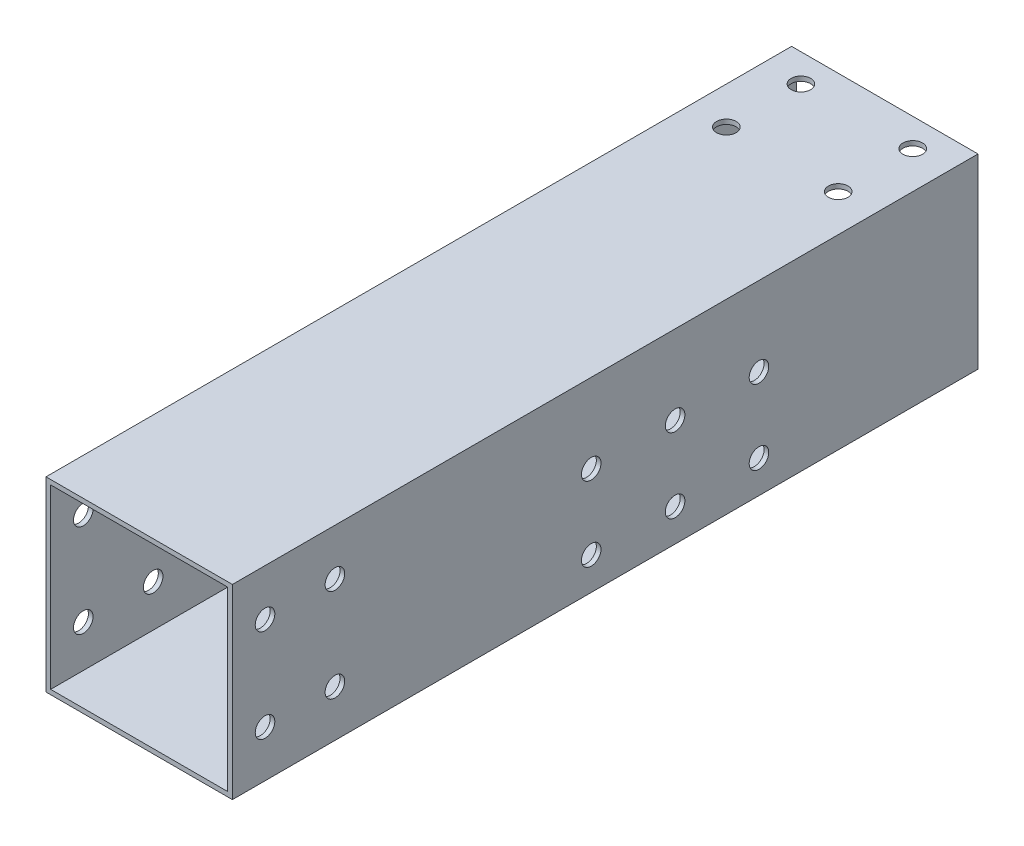
ISO-10303-21;
HEADER;
FILE_DESCRIPTION(('STEP AP214'),'2;1');
FILE_NAME('part.step','',(''),(''),'','','');
FILE_SCHEMA(('AUTOMOTIVE_DESIGN { 1 0 10303 214 1 1 1 1 }'));
ENDSEC;
DATA;
#1=APPLICATION_CONTEXT('core data for automotive mechanical design processes');
#2=APPLICATION_PROTOCOL_DEFINITION('international standard','automotive_design',2000,#1);
#3=PRODUCT_CONTEXT('',#1,'mechanical');
#4=PRODUCT('Part','Part','',(#3));
#5=PRODUCT_RELATED_PRODUCT_CATEGORY('part','',(#4));
#6=PRODUCT_DEFINITION_FORMATION('','',#4);
#7=PRODUCT_DEFINITION_CONTEXT('part definition',#1,'design');
#8=PRODUCT_DEFINITION('design','',#6,#7);
#9=PRODUCT_DEFINITION_SHAPE('','',#8);
#10=(LENGTH_UNIT() NAMED_UNIT(*) SI_UNIT(.MILLI.,.METRE.));
#11=(NAMED_UNIT(*) PLANE_ANGLE_UNIT() SI_UNIT($,.RADIAN.));
#12=(NAMED_UNIT(*) SI_UNIT($,.STERADIAN.) SOLID_ANGLE_UNIT());
#13=UNCERTAINTY_MEASURE_WITH_UNIT(LENGTH_MEASURE(1.E-05),#10,'distance_accuracy_value','');
#14=(GEOMETRIC_REPRESENTATION_CONTEXT(3) GLOBAL_UNCERTAINTY_ASSIGNED_CONTEXT((#13)) GLOBAL_UNIT_ASSIGNED_CONTEXT((#10,
#11,#12)) REPRESENTATION_CONTEXT('',''));
#15=CARTESIAN_POINT('',(0.,0.,0.));
#16=DIRECTION('',(0.,0.,1.));
#17=DIRECTION('',(1.,0.,0.));
#18=AXIS2_PLACEMENT_3D('',#15,#16,#17);
#19=CARTESIAN_POINT('',(0.,0.,160.));
#20=DIRECTION('',(0.,0.,-1.));
#21=DIRECTION('',(-1.,0.,0.));
#22=AXIS2_PLACEMENT_3D('',#19,#20,#21);
#23=PLANE('',#22);
#24=DIRECTION('',(0.,-1.,0.));
#25=VECTOR('',#24,1.);
#26=CARTESIAN_POINT('',(0.,0.,160.));
#27=LINE('',#26,#25);
#28=CARTESIAN_POINT('',(0.,40.,160.));
#29=VERTEX_POINT('',#28);
#30=CARTESIAN_POINT('',(0.,0.,160.));
#31=VERTEX_POINT('',#30);
#32=EDGE_CURVE('E140',#29,#31,#27,.T.);
#33=ORIENTED_EDGE('',*,*,#32,.T.);
#34=DIRECTION('',(1.,0.,0.));
#35=VECTOR('',#34,1.);
#36=CARTESIAN_POINT('',(0.,0.,160.));
#37=LINE('',#36,#35);
#38=CARTESIAN_POINT('',(40.,0.,160.));
#39=VERTEX_POINT('',#38);
#40=EDGE_CURVE('E143',#31,#39,#37,.T.);
#41=ORIENTED_EDGE('',*,*,#40,.T.);
#42=DIRECTION('',(0.,1.,0.));
#43=VECTOR('',#42,1.);
#44=CARTESIAN_POINT('',(40.,0.,160.));
#45=LINE('',#44,#43);
#46=CARTESIAN_POINT('',(40.,40.,160.));
#47=VERTEX_POINT('',#46);
#48=EDGE_CURVE('E146',#39,#47,#45,.T.);
#49=ORIENTED_EDGE('',*,*,#48,.T.);
#50=DIRECTION('',(-1.,0.,0.));
#51=VECTOR('',#50,1.);
#52=CARTESIAN_POINT('',(0.,40.,160.));
#53=LINE('',#52,#51);
#54=EDGE_CURVE('E148',#47,#29,#53,.T.);
#55=ORIENTED_EDGE('',*,*,#54,.T.);
#56=EDGE_LOOP('',(#33,#41,#49,#55));
#57=FACE_BOUND('',#56,.T.);
#58=DIRECTION('',(0.,-1.,0.));
#59=VECTOR('',#58,1.);
#60=CARTESIAN_POINT('',(1.,0.999999999999999,160.));
#61=LINE('',#60,#59);
#62=CARTESIAN_POINT('',(1.,39.,160.));
#63=VERTEX_POINT('',#62);
#64=CARTESIAN_POINT('',(1.,0.999999999999999,160.));
#65=VERTEX_POINT('',#64);
#66=EDGE_CURVE('E102',#63,#65,#61,.T.);
#67=ORIENTED_EDGE('',*,*,#66,.F.);
#68=DIRECTION('',(-1.,0.,0.));
#69=VECTOR('',#68,1.);
#70=CARTESIAN_POINT('',(1.,39.,160.));
#71=LINE('',#70,#69);
#72=CARTESIAN_POINT('',(39.,39.,160.));
#73=VERTEX_POINT('',#72);
#74=EDGE_CURVE('E124',#73,#63,#71,.T.);
#75=ORIENTED_EDGE('',*,*,#74,.F.);
#76=DIRECTION('',(0.,1.,0.));
#77=VECTOR('',#76,1.);
#78=CARTESIAN_POINT('',(39.,0.999999999999999,160.));
#79=LINE('',#78,#77);
#80=CARTESIAN_POINT('',(39.,0.999999999999999,160.));
#81=VERTEX_POINT('',#80);
#82=EDGE_CURVE('E122',#81,#73,#79,.T.);
#83=ORIENTED_EDGE('',*,*,#82,.F.);
#84=DIRECTION('',(1.,0.,0.));
#85=VECTOR('',#84,1.);
#86=CARTESIAN_POINT('',(1.,0.999999999999999,160.));
#87=LINE('',#86,#85);
#88=EDGE_CURVE('E110',#65,#81,#87,.T.);
#89=ORIENTED_EDGE('',*,*,#88,.F.);
#90=EDGE_LOOP('',(#67,#75,#83,#89));
#91=FACE_BOUND('',#90,.T.);
#92=ADVANCED_FACE('F35',(#57,#91),#23,.F.);
#93=CARTESIAN_POINT('',(0.,0.,0.));
#94=DIRECTION('',(0.,0.,-1.));
#95=DIRECTION('',(-1.,0.,0.));
#96=AXIS2_PLACEMENT_3D('',#93,#94,#95);
#97=PLANE('',#96);
#98=DIRECTION('',(0.,-1.,0.));
#99=VECTOR('',#98,1.);
#100=CARTESIAN_POINT('',(0.,0.,0.));
#101=LINE('',#100,#99);
#102=CARTESIAN_POINT('',(0.,40.,0.));
#103=VERTEX_POINT('',#102);
#104=CARTESIAN_POINT('',(0.,0.,0.));
#105=VERTEX_POINT('',#104);
#106=EDGE_CURVE('E118',#103,#105,#101,.T.);
#107=ORIENTED_EDGE('',*,*,#106,.F.);
#108=DIRECTION('',(-1.,0.,0.));
#109=VECTOR('',#108,1.);
#110=CARTESIAN_POINT('',(0.,40.,0.));
#111=LINE('',#110,#109);
#112=CARTESIAN_POINT('',(40.,40.,0.));
#113=VERTEX_POINT('',#112);
#114=EDGE_CURVE('E144',#113,#103,#111,.T.);
#115=ORIENTED_EDGE('',*,*,#114,.F.);
#116=DIRECTION('',(0.,1.,0.));
#117=VECTOR('',#116,1.);
#118=CARTESIAN_POINT('',(40.,0.,0.));
#119=LINE('',#118,#117);
#120=CARTESIAN_POINT('',(40.,0.,0.));
#121=VERTEX_POINT('',#120);
#122=EDGE_CURVE('E155',#121,#113,#119,.T.);
#123=ORIENTED_EDGE('',*,*,#122,.F.);
#124=DIRECTION('',(1.,0.,0.));
#125=VECTOR('',#124,1.);
#126=CARTESIAN_POINT('',(0.,0.,0.));
#127=LINE('',#126,#125);
#128=EDGE_CURVE('E153',#105,#121,#127,.T.);
#129=ORIENTED_EDGE('',*,*,#128,.F.);
#130=EDGE_LOOP('',(#107,#115,#123,#129));
#131=FACE_BOUND('',#130,.T.);
#132=DIRECTION('',(-1.,0.,0.));
#133=VECTOR('',#132,1.);
#134=CARTESIAN_POINT('',(1.,39.,0.));
#135=LINE('',#134,#133);
#136=CARTESIAN_POINT('',(39.,39.,0.));
#137=VERTEX_POINT('',#136);
#138=CARTESIAN_POINT('',(1.,39.,0.));
#139=VERTEX_POINT('',#138);
#140=EDGE_CURVE('E111',#137,#139,#135,.T.);
#141=ORIENTED_EDGE('',*,*,#140,.T.);
#142=DIRECTION('',(0.,-1.,0.));
#143=VECTOR('',#142,1.);
#144=CARTESIAN_POINT('',(1.,0.999999999999999,0.));
#145=LINE('',#144,#143);
#146=CARTESIAN_POINT('',(1.,0.999999999999999,0.));
#147=VERTEX_POINT('',#146);
#148=EDGE_CURVE('E60',#139,#147,#145,.T.);
#149=ORIENTED_EDGE('',*,*,#148,.T.);
#150=DIRECTION('',(1.,0.,0.));
#151=VECTOR('',#150,1.);
#152=CARTESIAN_POINT('',(1.,0.999999999999999,0.));
#153=LINE('',#152,#151);
#154=CARTESIAN_POINT('',(39.,0.999999999999999,0.));
#155=VERTEX_POINT('',#154);
#156=EDGE_CURVE('E117',#147,#155,#153,.T.);
#157=ORIENTED_EDGE('',*,*,#156,.T.);
#158=DIRECTION('',(0.,1.,0.));
#159=VECTOR('',#158,1.);
#160=CARTESIAN_POINT('',(39.,0.999999999999999,0.));
#161=LINE('',#160,#159);
#162=EDGE_CURVE('E132',#155,#137,#161,.T.);
#163=ORIENTED_EDGE('',*,*,#162,.T.);
#164=EDGE_LOOP('',(#141,#149,#157,#163));
#165=FACE_BOUND('',#164,.T.);
#166=ADVANCED_FACE('F297',(#131,#165),#97,.T.);
#167=CARTESIAN_POINT('',(0.,0.,160.));
#168=DIRECTION('',(1.,0.,0.));
#169=DIRECTION('',(0.,0.,-1.));
#170=AXIS2_PLACEMENT_3D('',#167,#168,#169);
#171=PLANE('',#170);
#172=CARTESIAN_POINT('',(0.,29.9999999999999,153.));
#173=DIRECTION('',(-1.,0.,0.));
#174=DIRECTION('',(0.,0.,1.));
#175=AXIS2_PLACEMENT_3D('',#172,#173,#174);
#176=CIRCLE('',#175,2.10000000000938);
#177=CARTESIAN_POINT('',(0.,29.9999999999999,155.10000000001));
#178=VERTEX_POINT('',#177);
#179=EDGE_CURVE('E412',#178,#178,#176,.T.);
#180=ORIENTED_EDGE('',*,*,#179,.F.);
#181=EDGE_LOOP('',(#180));
#182=FACE_BOUND('',#181,.T.);
#183=CARTESIAN_POINT('',(0.,9.99999999999989,153.));
#184=DIRECTION('',(-1.,0.,0.));
#185=DIRECTION('',(0.,0.,1.));
#186=AXIS2_PLACEMENT_3D('',#183,#184,#185);
#187=CIRCLE('',#186,2.10000000000938);
#188=CARTESIAN_POINT('',(0.,9.99999999999989,155.10000000001));
#189=VERTEX_POINT('',#188);
#190=EDGE_CURVE('E416',#189,#189,#187,.T.);
#191=ORIENTED_EDGE('',*,*,#190,.F.);
#192=EDGE_LOOP('',(#191));
#193=FACE_BOUND('',#192,.T.);
#194=CARTESIAN_POINT('',(0.,29.9999999999999,138.));
#195=DIRECTION('',(-1.,0.,0.));
#196=DIRECTION('',(0.,0.,1.));
#197=AXIS2_PLACEMENT_3D('',#194,#195,#196);
#198=CIRCLE('',#197,2.10000000000938);
#199=CARTESIAN_POINT('',(0.,29.9999999999999,140.100000000009));
#200=VERTEX_POINT('',#199);
#201=EDGE_CURVE('E420',#200,#200,#198,.T.);
#202=ORIENTED_EDGE('',*,*,#201,.F.);
#203=EDGE_LOOP('',(#202));
#204=FACE_BOUND('',#203,.T.);
#205=CARTESIAN_POINT('',(0.,23.0000000000002,82.9999999999977));
#206=DIRECTION('',(-1.,0.,0.));
#207=DIRECTION('',(0.,0.,1.));
#208=AXIS2_PLACEMENT_3D('',#205,#206,#207);
#209=CIRCLE('',#208,2.10000000003336);
#210=CARTESIAN_POINT('',(0.,23.0000000000002,85.1000000000311));
#211=VERTEX_POINT('',#210);
#212=EDGE_CURVE('E424',#211,#211,#209,.T.);
#213=ORIENTED_EDGE('',*,*,#212,.F.);
#214=EDGE_LOOP('',(#213));
#215=FACE_BOUND('',#214,.T.);
#216=CARTESIAN_POINT('',(0.,7.00000000000009,64.9999999999978));
#217=DIRECTION('',(-1.,0.,0.));
#218=DIRECTION('',(0.,0.,1.));
#219=AXIS2_PLACEMENT_3D('',#216,#217,#218);
#220=CIRCLE('',#219,2.10000000003336);
#221=CARTESIAN_POINT('',(0.,7.00000000000009,67.1000000000311));
#222=VERTEX_POINT('',#221);
#223=EDGE_CURVE('E428',#222,#222,#220,.T.);
#224=ORIENTED_EDGE('',*,*,#223,.F.);
#225=EDGE_LOOP('',(#224));
#226=FACE_BOUND('',#225,.T.);
#227=CARTESIAN_POINT('',(0.,23.0000000000001,64.9999999999977));
#228=DIRECTION('',(-1.,0.,0.));
#229=DIRECTION('',(0.,0.,1.));
#230=AXIS2_PLACEMENT_3D('',#227,#228,#229);
#231=CIRCLE('',#230,2.10000000003336);
#232=CARTESIAN_POINT('',(0.,23.0000000000001,67.1000000000311));
#233=VERTEX_POINT('',#232);
#234=EDGE_CURVE('E432',#233,#233,#231,.T.);
#235=ORIENTED_EDGE('',*,*,#234,.F.);
#236=EDGE_LOOP('',(#235));
#237=FACE_BOUND('',#236,.T.);
#238=CARTESIAN_POINT('',(0.,7.00000000000002,46.9999999999978));
#239=DIRECTION('',(-1.,0.,0.));
#240=DIRECTION('',(0.,0.,1.));
#241=AXIS2_PLACEMENT_3D('',#238,#239,#240);
#242=CIRCLE('',#241,2.10000000003336);
#243=CARTESIAN_POINT('',(0.,7.00000000000002,49.1000000000311));
#244=VERTEX_POINT('',#243);
#245=EDGE_CURVE('E436',#244,#244,#242,.T.);
#246=ORIENTED_EDGE('',*,*,#245,.F.);
#247=EDGE_LOOP('',(#246));
#248=FACE_BOUND('',#247,.T.);
#249=CARTESIAN_POINT('',(0.,23.,46.9999999999977));
#250=DIRECTION('',(-1.,0.,0.));
#251=DIRECTION('',(0.,0.,1.));
#252=AXIS2_PLACEMENT_3D('',#249,#250,#251);
#253=CIRCLE('',#252,2.10000000003336);
#254=CARTESIAN_POINT('',(0.,23.,49.1000000000311));
#255=VERTEX_POINT('',#254);
#256=EDGE_CURVE('E365',#255,#255,#253,.T.);
#257=ORIENTED_EDGE('',*,*,#256,.F.);
#258=EDGE_LOOP('',(#257));
#259=FACE_BOUND('',#258,.T.);
#260=CARTESIAN_POINT('',(0.,7.00000000000015,82.9999999999978));
#261=DIRECTION('',(-1.,0.,0.));
#262=DIRECTION('',(0.,0.,1.));
#263=AXIS2_PLACEMENT_3D('',#260,#261,#262);
#264=CIRCLE('',#263,2.10000000003336);
#265=CARTESIAN_POINT('',(0.,7.00000000000015,85.1000000000311));
#266=VERTEX_POINT('',#265);
#267=EDGE_CURVE('E442',#266,#266,#264,.T.);
#268=ORIENTED_EDGE('',*,*,#267,.F.);
#269=EDGE_LOOP('',(#268));
#270=FACE_BOUND('',#269,.T.);
#271=CARTESIAN_POINT('',(0.,9.99999999999988,138.));
#272=DIRECTION('',(-1.,0.,0.));
#273=DIRECTION('',(0.,0.,1.));
#274=AXIS2_PLACEMENT_3D('',#271,#272,#273);
#275=CIRCLE('',#274,2.10000000000938);
#276=CARTESIAN_POINT('',(0.,9.99999999999988,140.100000000009));
#277=VERTEX_POINT('',#276);
#278=EDGE_CURVE('E360',#277,#277,#275,.T.);
#279=ORIENTED_EDGE('',*,*,#278,.F.);
#280=EDGE_LOOP('',(#279));
#281=FACE_BOUND('',#280,.T.);
#282=ORIENTED_EDGE('',*,*,#106,.T.);
#283=DIRECTION('',(0.,0.,-1.));
#284=VECTOR('',#283,1.);
#285=CARTESIAN_POINT('',(0.,0.,160.));
#286=LINE('',#285,#284);
#287=EDGE_CURVE('E11',#31,#105,#286,.T.);
#288=ORIENTED_EDGE('',*,*,#287,.F.);
#289=ORIENTED_EDGE('',*,*,#32,.F.);
#290=DIRECTION('',(0.,0.,-1.));
#291=VECTOR('',#290,1.);
#292=CARTESIAN_POINT('',(0.,40.,160.));
#293=LINE('',#292,#291);
#294=EDGE_CURVE('E150',#29,#103,#293,.T.);
#295=ORIENTED_EDGE('',*,*,#294,.T.);
#296=EDGE_LOOP('',(#282,#288,#289,#295));
#297=FACE_BOUND('',#296,.T.);
#298=ADVANCED_FACE('F37',(#182,#193,#204,#215,#226,#237,#248,#259,#270,#281,#297),#171,.F.);
#299=CARTESIAN_POINT('',(0.,0.,160.));
#300=DIRECTION('',(0.,1.,0.));
#301=DIRECTION('',(0.,0.,1.));
#302=AXIS2_PLACEMENT_3D('',#299,#300,#301);
#303=PLANE('',#302);
#304=CARTESIAN_POINT('',(32.0000000002429,0.,5.99999999998566));
#305=DIRECTION('',(0.,-1.,0.));
#306=DIRECTION('',(0.,0.,-1.));
#307=AXIS2_PLACEMENT_3D('',#304,#305,#306);
#308=CIRCLE('',#307,2.09999999982409);
#309=CARTESIAN_POINT('',(32.0000000002429,0.,3.90000000016157));
#310=VERTEX_POINT('',#309);
#311=EDGE_CURVE('E230',#310,#310,#308,.T.);
#312=ORIENTED_EDGE('',*,*,#311,.F.);
#313=EDGE_LOOP('',(#312));
#314=FACE_BOUND('',#313,.T.);
#315=CARTESIAN_POINT('',(8.00000000024295,0.,21.9999999999857));
#316=DIRECTION('',(0.,-1.,0.));
#317=DIRECTION('',(0.,0.,-1.));
#318=AXIS2_PLACEMENT_3D('',#315,#316,#317);
#319=CIRCLE('',#318,2.09999999982409);
#320=CARTESIAN_POINT('',(8.00000000024295,0.,19.9000000001616));
#321=VERTEX_POINT('',#320);
#322=EDGE_CURVE('E241',#321,#321,#319,.T.);
#323=ORIENTED_EDGE('',*,*,#322,.F.);
#324=EDGE_LOOP('',(#323));
#325=FACE_BOUND('',#324,.T.);
#326=CARTESIAN_POINT('',(32.0000000002429,0.,21.9999999999857));
#327=DIRECTION('',(0.,-1.,0.));
#328=DIRECTION('',(0.,0.,-1.));
#329=AXIS2_PLACEMENT_3D('',#326,#327,#328);
#330=CIRCLE('',#329,2.09999999982409);
#331=CARTESIAN_POINT('',(32.0000000002429,0.,19.9000000001616));
#332=VERTEX_POINT('',#331);
#333=EDGE_CURVE('E235',#332,#332,#330,.T.);
#334=ORIENTED_EDGE('',*,*,#333,.F.);
#335=EDGE_LOOP('',(#334));
#336=FACE_BOUND('',#335,.T.);
#337=CARTESIAN_POINT('',(8.00000000024294,0.,5.99999999998566));
#338=DIRECTION('',(0.,-1.,0.));
#339=DIRECTION('',(0.,0.,-1.));
#340=AXIS2_PLACEMENT_3D('',#337,#338,#339);
#341=CIRCLE('',#340,2.09999999982409);
#342=CARTESIAN_POINT('',(8.00000000024294,0.,3.90000000016157));
#343=VERTEX_POINT('',#342);
#344=EDGE_CURVE('E234',#343,#343,#341,.T.);
#345=ORIENTED_EDGE('',*,*,#344,.F.);
#346=EDGE_LOOP('',(#345));
#347=FACE_BOUND('',#346,.T.);
#348=ORIENTED_EDGE('',*,*,#128,.T.);
#349=DIRECTION('',(0.,0.,-1.));
#350=VECTOR('',#349,1.);
#351=CARTESIAN_POINT('',(40.,0.,160.));
#352=LINE('',#351,#350);
#353=EDGE_CURVE('E44',#39,#121,#352,.T.);
#354=ORIENTED_EDGE('',*,*,#353,.F.);
#355=ORIENTED_EDGE('',*,*,#40,.F.);
#356=ORIENTED_EDGE('',*,*,#287,.T.);
#357=EDGE_LOOP('',(#348,#354,#355,#356));
#358=FACE_BOUND('',#357,.T.);
#359=ADVANCED_FACE('F283',(#314,#325,#336,#347,#358),#303,.F.);
#360=CARTESIAN_POINT('',(40.,0.,160.));
#361=DIRECTION('',(-1.,0.,0.));
#362=DIRECTION('',(0.,0.,1.));
#363=AXIS2_PLACEMENT_3D('',#360,#361,#362);
#364=PLANE('',#363);
#365=CARTESIAN_POINT('',(40.,29.9999999999999,153.));
#366=DIRECTION('',(-1.,0.,0.));
#367=DIRECTION('',(0.,0.,1.));
#368=AXIS2_PLACEMENT_3D('',#365,#366,#367);
#369=CIRCLE('',#368,2.10000000000938);
#370=CARTESIAN_POINT('',(40.,29.9999999999999,155.10000000001));
#371=VERTEX_POINT('',#370);
#372=EDGE_CURVE('E324',#371,#371,#369,.T.);
#373=ORIENTED_EDGE('',*,*,#372,.T.);
#374=EDGE_LOOP('',(#373));
#375=FACE_BOUND('',#374,.T.);
#376=CARTESIAN_POINT('',(40.,9.99999999999989,153.));
#377=DIRECTION('',(-1.,0.,0.));
#378=DIRECTION('',(0.,0.,1.));
#379=AXIS2_PLACEMENT_3D('',#376,#377,#378);
#380=CIRCLE('',#379,2.10000000000938);
#381=CARTESIAN_POINT('',(40.,9.99999999999989,155.10000000001));
#382=VERTEX_POINT('',#381);
#383=EDGE_CURVE('E328',#382,#382,#380,.T.);
#384=ORIENTED_EDGE('',*,*,#383,.T.);
#385=EDGE_LOOP('',(#384));
#386=FACE_BOUND('',#385,.T.);
#387=CARTESIAN_POINT('',(40.,29.9999999999999,138.));
#388=DIRECTION('',(-1.,0.,0.));
#389=DIRECTION('',(0.,0.,1.));
#390=AXIS2_PLACEMENT_3D('',#387,#388,#389);
#391=CIRCLE('',#390,2.10000000000938);
#392=CARTESIAN_POINT('',(40.,29.9999999999999,140.100000000009));
#393=VERTEX_POINT('',#392);
#394=EDGE_CURVE('E332',#393,#393,#391,.T.);
#395=ORIENTED_EDGE('',*,*,#394,.T.);
#396=EDGE_LOOP('',(#395));
#397=FACE_BOUND('',#396,.T.);
#398=CARTESIAN_POINT('',(40.,23.0000000000002,82.9999999999977));
#399=DIRECTION('',(-1.,0.,0.));
#400=DIRECTION('',(0.,0.,1.));
#401=AXIS2_PLACEMENT_3D('',#398,#399,#400);
#402=CIRCLE('',#401,2.10000000003336);
#403=CARTESIAN_POINT('',(40.,23.0000000000002,85.1000000000311));
#404=VERTEX_POINT('',#403);
#405=EDGE_CURVE('E336',#404,#404,#402,.T.);
#406=ORIENTED_EDGE('',*,*,#405,.T.);
#407=EDGE_LOOP('',(#406));
#408=FACE_BOUND('',#407,.T.);
#409=CARTESIAN_POINT('',(40.,7.00000000000009,64.9999999999978));
#410=DIRECTION('',(-1.,0.,0.));
#411=DIRECTION('',(0.,0.,1.));
#412=AXIS2_PLACEMENT_3D('',#409,#410,#411);
#413=CIRCLE('',#412,2.10000000003336);
#414=CARTESIAN_POINT('',(40.,7.00000000000009,67.1000000000311));
#415=VERTEX_POINT('',#414);
#416=EDGE_CURVE('E340',#415,#415,#413,.T.);
#417=ORIENTED_EDGE('',*,*,#416,.T.);
#418=EDGE_LOOP('',(#417));
#419=FACE_BOUND('',#418,.T.);
#420=CARTESIAN_POINT('',(40.,23.0000000000001,64.9999999999977));
#421=DIRECTION('',(-1.,0.,0.));
#422=DIRECTION('',(0.,0.,1.));
#423=AXIS2_PLACEMENT_3D('',#420,#421,#422);
#424=CIRCLE('',#423,2.10000000003336);
#425=CARTESIAN_POINT('',(40.,23.0000000000001,67.1000000000311));
#426=VERTEX_POINT('',#425);
#427=EDGE_CURVE('E344',#426,#426,#424,.T.);
#428=ORIENTED_EDGE('',*,*,#427,.T.);
#429=EDGE_LOOP('',(#428));
#430=FACE_BOUND('',#429,.T.);
#431=CARTESIAN_POINT('',(40.,7.00000000000002,46.9999999999978));
#432=DIRECTION('',(-1.,0.,0.));
#433=DIRECTION('',(0.,0.,1.));
#434=AXIS2_PLACEMENT_3D('',#431,#432,#433);
#435=CIRCLE('',#434,2.10000000003336);
#436=CARTESIAN_POINT('',(40.,7.00000000000002,49.1000000000311));
#437=VERTEX_POINT('',#436);
#438=EDGE_CURVE('E348',#437,#437,#435,.T.);
#439=ORIENTED_EDGE('',*,*,#438,.T.);
#440=EDGE_LOOP('',(#439));
#441=FACE_BOUND('',#440,.T.);
#442=CARTESIAN_POINT('',(40.,23.,46.9999999999977));
#443=DIRECTION('',(-1.,0.,0.));
#444=DIRECTION('',(0.,0.,1.));
#445=AXIS2_PLACEMENT_3D('',#442,#443,#444);
#446=CIRCLE('',#445,2.10000000003336);
#447=CARTESIAN_POINT('',(40.,23.,49.1000000000311));
#448=VERTEX_POINT('',#447);
#449=EDGE_CURVE('E352',#448,#448,#446,.T.);
#450=ORIENTED_EDGE('',*,*,#449,.T.);
#451=EDGE_LOOP('',(#450));
#452=FACE_BOUND('',#451,.T.);
#453=CARTESIAN_POINT('',(40.,7.00000000000015,82.9999999999978));
#454=DIRECTION('',(-1.,0.,0.));
#455=DIRECTION('',(0.,0.,1.));
#456=AXIS2_PLACEMENT_3D('',#453,#454,#455);
#457=CIRCLE('',#456,2.10000000003336);
#458=CARTESIAN_POINT('',(40.,7.00000000000015,85.1000000000311));
#459=VERTEX_POINT('',#458);
#460=EDGE_CURVE('E356',#459,#459,#457,.T.);
#461=ORIENTED_EDGE('',*,*,#460,.T.);
#462=EDGE_LOOP('',(#461));
#463=FACE_BOUND('',#462,.T.);
#464=CARTESIAN_POINT('',(40.,9.99999999999988,138.));
#465=DIRECTION('',(-1.,0.,0.));
#466=DIRECTION('',(0.,0.,1.));
#467=AXIS2_PLACEMENT_3D('',#464,#465,#466);
#468=CIRCLE('',#467,2.10000000000938);
#469=CARTESIAN_POINT('',(40.,9.99999999999988,140.100000000009));
#470=VERTEX_POINT('',#469);
#471=EDGE_CURVE('E185',#470,#470,#468,.T.);
#472=ORIENTED_EDGE('',*,*,#471,.T.);
#473=EDGE_LOOP('',(#472));
#474=FACE_BOUND('',#473,.T.);
#475=ORIENTED_EDGE('',*,*,#122,.T.);
#476=DIRECTION('',(0.,0.,-1.));
#477=VECTOR('',#476,1.);
#478=CARTESIAN_POINT('',(40.,40.,160.));
#479=LINE('',#478,#477);
#480=EDGE_CURVE('E160',#47,#113,#479,.T.);
#481=ORIENTED_EDGE('',*,*,#480,.F.);
#482=ORIENTED_EDGE('',*,*,#48,.F.);
#483=ORIENTED_EDGE('',*,*,#353,.T.);
#484=EDGE_LOOP('',(#475,#481,#482,#483));
#485=FACE_BOUND('',#484,.T.);
#486=ADVANCED_FACE('F286',(#375,#386,#397,#408,#419,#430,#441,#452,#463,#474,#485),#364,.F.);
#487=CARTESIAN_POINT('',(0.,40.,160.));
#488=DIRECTION('',(0.,-1.,0.));
#489=DIRECTION('',(0.,0.,-1.));
#490=AXIS2_PLACEMENT_3D('',#487,#488,#489);
#491=PLANE('',#490);
#492=CARTESIAN_POINT('',(32.0000000002429,40.,5.99999999998566));
#493=DIRECTION('',(0.,-1.,0.));
#494=DIRECTION('',(0.,0.,-1.));
#495=AXIS2_PLACEMENT_3D('',#492,#493,#494);
#496=CIRCLE('',#495,2.09999999982409);
#497=CARTESIAN_POINT('',(32.0000000002429,40.,3.90000000016157));
#498=VERTEX_POINT('',#497);
#499=EDGE_CURVE('E244',#498,#498,#496,.T.);
#500=ORIENTED_EDGE('',*,*,#499,.T.);
#501=EDGE_LOOP('',(#500));
#502=FACE_BOUND('',#501,.T.);
#503=CARTESIAN_POINT('',(8.00000000024295,40.,21.9999999999857));
#504=DIRECTION('',(0.,-1.,0.));
#505=DIRECTION('',(0.,0.,-1.));
#506=AXIS2_PLACEMENT_3D('',#503,#504,#505);
#507=CIRCLE('',#506,2.09999999982409);
#508=CARTESIAN_POINT('',(8.00000000024295,40.,19.9000000001616));
#509=VERTEX_POINT('',#508);
#510=EDGE_CURVE('E238',#509,#509,#507,.T.);
#511=ORIENTED_EDGE('',*,*,#510,.T.);
#512=EDGE_LOOP('',(#511));
#513=FACE_BOUND('',#512,.T.);
#514=CARTESIAN_POINT('',(32.0000000002429,40.,21.9999999999857));
#515=DIRECTION('',(0.,-1.,0.));
#516=DIRECTION('',(0.,0.,-1.));
#517=AXIS2_PLACEMENT_3D('',#514,#515,#516);
#518=CIRCLE('',#517,2.09999999982409);
#519=CARTESIAN_POINT('',(32.0000000002429,40.,19.9000000001616));
#520=VERTEX_POINT('',#519);
#521=EDGE_CURVE('E231',#520,#520,#518,.T.);
#522=ORIENTED_EDGE('',*,*,#521,.T.);
#523=EDGE_LOOP('',(#522));
#524=FACE_BOUND('',#523,.T.);
#525=CARTESIAN_POINT('',(8.00000000024294,40.,5.99999999998566));
#526=DIRECTION('',(0.,-1.,0.));
#527=DIRECTION('',(0.,0.,-1.));
#528=AXIS2_PLACEMENT_3D('',#525,#526,#527);
#529=CIRCLE('',#528,2.09999999982409);
#530=CARTESIAN_POINT('',(8.00000000024294,40.,3.90000000016157));
#531=VERTEX_POINT('',#530);
#532=EDGE_CURVE('E169',#531,#531,#529,.T.);
#533=ORIENTED_EDGE('',*,*,#532,.T.);
#534=EDGE_LOOP('',(#533));
#535=FACE_BOUND('',#534,.T.);
#536=ORIENTED_EDGE('',*,*,#114,.T.);
#537=ORIENTED_EDGE('',*,*,#294,.F.);
#538=ORIENTED_EDGE('',*,*,#54,.F.);
#539=ORIENTED_EDGE('',*,*,#480,.T.);
#540=EDGE_LOOP('',(#536,#537,#538,#539));
#541=FACE_BOUND('',#540,.T.);
#542=ADVANCED_FACE('F301',(#502,#513,#524,#535,#541),#491,.F.);
#543=CARTESIAN_POINT('',(1.,0.999999999999999,160.));
#544=DIRECTION('',(1.,0.,0.));
#545=DIRECTION('',(0.,0.,-1.));
#546=AXIS2_PLACEMENT_3D('',#543,#544,#545);
#547=PLANE('',#546);
#548=CARTESIAN_POINT('',(1.,29.9999999999999,153.));
#549=DIRECTION('',(1.,0.,0.));
#550=DIRECTION('',(0.,0.,-1.));
#551=AXIS2_PLACEMENT_3D('',#548,#549,#550);
#552=CIRCLE('',#551,2.10000000000938);
#553=CARTESIAN_POINT('',(1.,29.9999999999999,150.899999999991));
#554=VERTEX_POINT('',#553);
#555=EDGE_CURVE('E227',#554,#554,#552,.T.);
#556=ORIENTED_EDGE('',*,*,#555,.F.);
#557=EDGE_LOOP('',(#556));
#558=FACE_BOUND('',#557,.T.);
#559=CARTESIAN_POINT('',(1.,9.99999999999989,153.));
#560=DIRECTION('',(1.,0.,0.));
#561=DIRECTION('',(0.,0.,-1.));
#562=AXIS2_PLACEMENT_3D('',#559,#560,#561);
#563=CIRCLE('',#562,2.10000000000938);
#564=CARTESIAN_POINT('',(1.,9.99999999999989,150.899999999991));
#565=VERTEX_POINT('',#564);
#566=EDGE_CURVE('E215',#565,#565,#563,.T.);
#567=ORIENTED_EDGE('',*,*,#566,.F.);
#568=EDGE_LOOP('',(#567));
#569=FACE_BOUND('',#568,.T.);
#570=CARTESIAN_POINT('',(1.,29.9999999999999,138.));
#571=DIRECTION('',(1.,0.,0.));
#572=DIRECTION('',(0.,0.,-1.));
#573=AXIS2_PLACEMENT_3D('',#570,#571,#572);
#574=CIRCLE('',#573,2.10000000000938);
#575=CARTESIAN_POINT('',(1.,29.9999999999999,135.899999999991));
#576=VERTEX_POINT('',#575);
#577=EDGE_CURVE('E212',#576,#576,#574,.T.);
#578=ORIENTED_EDGE('',*,*,#577,.F.);
#579=EDGE_LOOP('',(#578));
#580=FACE_BOUND('',#579,.T.);
#581=CARTESIAN_POINT('',(1.,23.0000000000002,82.9999999999977));
#582=DIRECTION('',(1.,0.,0.));
#583=DIRECTION('',(0.,0.,-1.));
#584=AXIS2_PLACEMENT_3D('',#581,#582,#583);
#585=CIRCLE('',#584,2.10000000003336);
#586=CARTESIAN_POINT('',(1.,23.0000000000002,80.8999999999644));
#587=VERTEX_POINT('',#586);
#588=EDGE_CURVE('E209',#587,#587,#585,.T.);
#589=ORIENTED_EDGE('',*,*,#588,.F.);
#590=EDGE_LOOP('',(#589));
#591=FACE_BOUND('',#590,.T.);
#592=CARTESIAN_POINT('',(1.,7.00000000000009,64.9999999999978));
#593=DIRECTION('',(1.,0.,0.));
#594=DIRECTION('',(0.,0.,-1.));
#595=AXIS2_PLACEMENT_3D('',#592,#593,#594);
#596=CIRCLE('',#595,2.10000000003336);
#597=CARTESIAN_POINT('',(1.,7.00000000000009,62.8999999999644));
#598=VERTEX_POINT('',#597);
#599=EDGE_CURVE('E205',#598,#598,#596,.T.);
#600=ORIENTED_EDGE('',*,*,#599,.F.);
#601=EDGE_LOOP('',(#600));
#602=FACE_BOUND('',#601,.T.);
#603=CARTESIAN_POINT('',(1.,23.0000000000001,64.9999999999977));
#604=DIRECTION('',(1.,0.,0.));
#605=DIRECTION('',(0.,0.,-1.));
#606=AXIS2_PLACEMENT_3D('',#603,#604,#605);
#607=CIRCLE('',#606,2.10000000003336);
#608=CARTESIAN_POINT('',(1.,23.0000000000001,62.8999999999644));
#609=VERTEX_POINT('',#608);
#610=EDGE_CURVE('E201',#609,#609,#607,.T.);
#611=ORIENTED_EDGE('',*,*,#610,.F.);
#612=EDGE_LOOP('',(#611));
#613=FACE_BOUND('',#612,.T.);
#614=CARTESIAN_POINT('',(1.,7.00000000000002,46.9999999999978));
#615=DIRECTION('',(1.,0.,0.));
#616=DIRECTION('',(0.,0.,-1.));
#617=AXIS2_PLACEMENT_3D('',#614,#615,#616);
#618=CIRCLE('',#617,2.10000000003336);
#619=CARTESIAN_POINT('',(1.,7.00000000000002,44.8999999999644));
#620=VERTEX_POINT('',#619);
#621=EDGE_CURVE('E197',#620,#620,#618,.T.);
#622=ORIENTED_EDGE('',*,*,#621,.F.);
#623=EDGE_LOOP('',(#622));
#624=FACE_BOUND('',#623,.T.);
#625=CARTESIAN_POINT('',(1.,23.,46.9999999999977));
#626=DIRECTION('',(1.,0.,0.));
#627=DIRECTION('',(0.,0.,-1.));
#628=AXIS2_PLACEMENT_3D('',#625,#626,#627);
#629=CIRCLE('',#628,2.10000000003336);
#630=CARTESIAN_POINT('',(1.,23.,44.8999999999644));
#631=VERTEX_POINT('',#630);
#632=EDGE_CURVE('E193',#631,#631,#629,.T.);
#633=ORIENTED_EDGE('',*,*,#632,.F.);
#634=EDGE_LOOP('',(#633));
#635=FACE_BOUND('',#634,.T.);
#636=CARTESIAN_POINT('',(1.,7.00000000000015,82.9999999999978));
#637=DIRECTION('',(1.,0.,0.));
#638=DIRECTION('',(0.,0.,-1.));
#639=AXIS2_PLACEMENT_3D('',#636,#637,#638);
#640=CIRCLE('',#639,2.10000000003336);
#641=CARTESIAN_POINT('',(1.,7.00000000000015,80.8999999999644));
#642=VERTEX_POINT('',#641);
#643=EDGE_CURVE('E189',#642,#642,#640,.T.);
#644=ORIENTED_EDGE('',*,*,#643,.F.);
#645=EDGE_LOOP('',(#644));
#646=FACE_BOUND('',#645,.T.);
#647=CARTESIAN_POINT('',(1.,9.99999999999988,138.));
#648=DIRECTION('',(1.,0.,0.));
#649=DIRECTION('',(0.,0.,-1.));
#650=AXIS2_PLACEMENT_3D('',#647,#648,#649);
#651=CIRCLE('',#650,2.10000000000938);
#652=CARTESIAN_POINT('',(1.,9.99999999999988,135.899999999991));
#653=VERTEX_POINT('',#652);
#654=EDGE_CURVE('E184',#653,#653,#651,.T.);
#655=ORIENTED_EDGE('',*,*,#654,.F.);
#656=EDGE_LOOP('',(#655));
#657=FACE_BOUND('',#656,.T.);
#658=ORIENTED_EDGE('',*,*,#148,.F.);
#659=DIRECTION('',(0.,0.,-1.));
#660=VECTOR('',#659,1.);
#661=CARTESIAN_POINT('',(1.,39.,160.));
#662=LINE('',#661,#660);
#663=EDGE_CURVE('E106',#63,#139,#662,.T.);
#664=ORIENTED_EDGE('',*,*,#663,.F.);
#665=ORIENTED_EDGE('',*,*,#66,.T.);
#666=DIRECTION('',(0.,0.,-1.));
#667=VECTOR('',#666,1.);
#668=CARTESIAN_POINT('',(1.,0.999999999999999,160.));
#669=LINE('',#668,#667);
#670=EDGE_CURVE('E105',#65,#147,#669,.T.);
#671=ORIENTED_EDGE('',*,*,#670,.T.);
#672=EDGE_LOOP('',(#658,#664,#665,#671));
#673=FACE_BOUND('',#672,.T.);
#674=ADVANCED_FACE('F104',(#558,#569,#580,#591,#602,#613,#624,#635,#646,#657,#673),#547,.T.);
#675=CARTESIAN_POINT('',(1.,0.999999999999999,160.));
#676=DIRECTION('',(0.,1.,0.));
#677=DIRECTION('',(0.,0.,1.));
#678=AXIS2_PLACEMENT_3D('',#675,#676,#677);
#679=PLANE('',#678);
#680=CARTESIAN_POINT('',(32.0000000002429,1.,5.99999999998566));
#681=DIRECTION('',(0.,1.,0.));
#682=DIRECTION('',(0.,0.,1.));
#683=AXIS2_PLACEMENT_3D('',#680,#681,#682);
#684=CIRCLE('',#683,2.09999999982409);
#685=CARTESIAN_POINT('',(32.0000000002429,1.,8.09999999980975));
#686=VERTEX_POINT('',#685);
#687=EDGE_CURVE('E130',#686,#686,#684,.T.);
#688=ORIENTED_EDGE('',*,*,#687,.F.);
#689=EDGE_LOOP('',(#688));
#690=FACE_BOUND('',#689,.T.);
#691=CARTESIAN_POINT('',(8.00000000024295,1.,21.9999999999857));
#692=DIRECTION('',(0.,1.,0.));
#693=DIRECTION('',(0.,0.,1.));
#694=AXIS2_PLACEMENT_3D('',#691,#692,#693);
#695=CIRCLE('',#694,2.09999999982409);
#696=CARTESIAN_POINT('',(8.00000000024295,1.,24.0999999998098));
#697=VERTEX_POINT('',#696);
#698=EDGE_CURVE('E177',#697,#697,#695,.T.);
#699=ORIENTED_EDGE('',*,*,#698,.F.);
#700=EDGE_LOOP('',(#699));
#701=FACE_BOUND('',#700,.T.);
#702=CARTESIAN_POINT('',(32.0000000002429,1.,21.9999999999857));
#703=DIRECTION('',(0.,1.,0.));
#704=DIRECTION('',(0.,0.,1.));
#705=AXIS2_PLACEMENT_3D('',#702,#703,#704);
#706=CIRCLE('',#705,2.09999999982409);
#707=CARTESIAN_POINT('',(32.0000000002429,1.,24.0999999998098));
#708=VERTEX_POINT('',#707);
#709=EDGE_CURVE('E173',#708,#708,#706,.T.);
#710=ORIENTED_EDGE('',*,*,#709,.F.);
#711=EDGE_LOOP('',(#710));
#712=FACE_BOUND('',#711,.T.);
#713=CARTESIAN_POINT('',(8.00000000024294,1.,5.99999999998566));
#714=DIRECTION('',(0.,1.,0.));
#715=DIRECTION('',(0.,0.,1.));
#716=AXIS2_PLACEMENT_3D('',#713,#714,#715);
#717=CIRCLE('',#716,2.09999999982409);
#718=CARTESIAN_POINT('',(8.00000000024294,1.,8.09999999980975));
#719=VERTEX_POINT('',#718);
#720=EDGE_CURVE('E168',#719,#719,#717,.T.);
#721=ORIENTED_EDGE('',*,*,#720,.F.);
#722=EDGE_LOOP('',(#721));
#723=FACE_BOUND('',#722,.T.);
#724=ORIENTED_EDGE('',*,*,#156,.F.);
#725=ORIENTED_EDGE('',*,*,#670,.F.);
#726=ORIENTED_EDGE('',*,*,#88,.T.);
#727=DIRECTION('',(0.,0.,-1.));
#728=VECTOR('',#727,1.);
#729=CARTESIAN_POINT('',(39.,0.999999999999999,160.));
#730=LINE('',#729,#728);
#731=EDGE_CURVE('E119',#81,#155,#730,.T.);
#732=ORIENTED_EDGE('',*,*,#731,.T.);
#733=EDGE_LOOP('',(#724,#725,#726,#732));
#734=FACE_BOUND('',#733,.T.);
#735=ADVANCED_FACE('F114',(#690,#701,#712,#723,#734),#679,.T.);
#736=CARTESIAN_POINT('',(39.,0.999999999999999,160.));
#737=DIRECTION('',(-1.,0.,0.));
#738=DIRECTION('',(0.,0.,1.));
#739=AXIS2_PLACEMENT_3D('',#736,#737,#738);
#740=PLANE('',#739);
#741=CARTESIAN_POINT('',(39.,29.9999999999999,153.));
#742=DIRECTION('',(-1.,0.,0.));
#743=DIRECTION('',(0.,0.,1.));
#744=AXIS2_PLACEMENT_3D('',#741,#742,#743);
#745=CIRCLE('',#744,2.10000000000938);
#746=CARTESIAN_POINT('',(39.,29.9999999999999,155.10000000001));
#747=VERTEX_POINT('',#746);
#748=EDGE_CURVE('E39',#747,#747,#745,.T.);
#749=ORIENTED_EDGE('',*,*,#748,.F.);
#750=EDGE_LOOP('',(#749));
#751=FACE_BOUND('',#750,.T.);
#752=CARTESIAN_POINT('',(39.,9.99999999999989,153.));
#753=DIRECTION('',(-1.,0.,0.));
#754=DIRECTION('',(0.,0.,1.));
#755=AXIS2_PLACEMENT_3D('',#752,#753,#754);
#756=CIRCLE('',#755,2.10000000000938);
#757=CARTESIAN_POINT('',(39.,9.99999999999989,155.10000000001));
#758=VERTEX_POINT('',#757);
#759=EDGE_CURVE('E213',#758,#758,#756,.T.);
#760=ORIENTED_EDGE('',*,*,#759,.F.);
#761=EDGE_LOOP('',(#760));
#762=FACE_BOUND('',#761,.T.);
#763=CARTESIAN_POINT('',(39.,29.9999999999999,138.));
#764=DIRECTION('',(-1.,0.,0.));
#765=DIRECTION('',(0.,0.,1.));
#766=AXIS2_PLACEMENT_3D('',#763,#764,#765);
#767=CIRCLE('',#766,2.10000000000938);
#768=CARTESIAN_POINT('',(39.,29.9999999999999,140.100000000009));
#769=VERTEX_POINT('',#768);
#770=EDGE_CURVE('E210',#769,#769,#767,.T.);
#771=ORIENTED_EDGE('',*,*,#770,.F.);
#772=EDGE_LOOP('',(#771));
#773=FACE_BOUND('',#772,.T.);
#774=CARTESIAN_POINT('',(39.,23.0000000000002,82.9999999999977));
#775=DIRECTION('',(-1.,0.,0.));
#776=DIRECTION('',(0.,0.,1.));
#777=AXIS2_PLACEMENT_3D('',#774,#775,#776);
#778=CIRCLE('',#777,2.10000000003336);
#779=CARTESIAN_POINT('',(39.,23.0000000000002,85.1000000000311));
#780=VERTEX_POINT('',#779);
#781=EDGE_CURVE('E206',#780,#780,#778,.T.);
#782=ORIENTED_EDGE('',*,*,#781,.F.);
#783=EDGE_LOOP('',(#782));
#784=FACE_BOUND('',#783,.T.);
#785=CARTESIAN_POINT('',(39.,7.00000000000009,64.9999999999978));
#786=DIRECTION('',(-1.,0.,0.));
#787=DIRECTION('',(0.,0.,1.));
#788=AXIS2_PLACEMENT_3D('',#785,#786,#787);
#789=CIRCLE('',#788,2.10000000003336);
#790=CARTESIAN_POINT('',(39.,7.00000000000009,67.1000000000311));
#791=VERTEX_POINT('',#790);
#792=EDGE_CURVE('E202',#791,#791,#789,.T.);
#793=ORIENTED_EDGE('',*,*,#792,.F.);
#794=EDGE_LOOP('',(#793));
#795=FACE_BOUND('',#794,.T.);
#796=CARTESIAN_POINT('',(39.,23.0000000000001,64.9999999999977));
#797=DIRECTION('',(-1.,0.,0.));
#798=DIRECTION('',(0.,0.,1.));
#799=AXIS2_PLACEMENT_3D('',#796,#797,#798);
#800=CIRCLE('',#799,2.10000000003336);
#801=CARTESIAN_POINT('',(39.,23.0000000000001,67.1000000000311));
#802=VERTEX_POINT('',#801);
#803=EDGE_CURVE('E198',#802,#802,#800,.T.);
#804=ORIENTED_EDGE('',*,*,#803,.F.);
#805=EDGE_LOOP('',(#804));
#806=FACE_BOUND('',#805,.T.);
#807=CARTESIAN_POINT('',(39.,7.00000000000002,46.9999999999978));
#808=DIRECTION('',(-1.,0.,0.));
#809=DIRECTION('',(0.,0.,1.));
#810=AXIS2_PLACEMENT_3D('',#807,#808,#809);
#811=CIRCLE('',#810,2.10000000003336);
#812=CARTESIAN_POINT('',(39.,7.00000000000002,49.1000000000311));
#813=VERTEX_POINT('',#812);
#814=EDGE_CURVE('E194',#813,#813,#811,.T.);
#815=ORIENTED_EDGE('',*,*,#814,.F.);
#816=EDGE_LOOP('',(#815));
#817=FACE_BOUND('',#816,.T.);
#818=CARTESIAN_POINT('',(39.,23.,46.9999999999977));
#819=DIRECTION('',(-1.,0.,0.));
#820=DIRECTION('',(0.,0.,1.));
#821=AXIS2_PLACEMENT_3D('',#818,#819,#820);
#822=CIRCLE('',#821,2.10000000003336);
#823=CARTESIAN_POINT('',(39.,23.,49.1000000000311));
#824=VERTEX_POINT('',#823);
#825=EDGE_CURVE('E190',#824,#824,#822,.T.);
#826=ORIENTED_EDGE('',*,*,#825,.F.);
#827=EDGE_LOOP('',(#826));
#828=FACE_BOUND('',#827,.T.);
#829=CARTESIAN_POINT('',(39.,7.00000000000015,82.9999999999978));
#830=DIRECTION('',(-1.,0.,0.));
#831=DIRECTION('',(0.,0.,1.));
#832=AXIS2_PLACEMENT_3D('',#829,#830,#831);
#833=CIRCLE('',#832,2.10000000003336);
#834=CARTESIAN_POINT('',(39.,7.00000000000015,85.1000000000311));
#835=VERTEX_POINT('',#834);
#836=EDGE_CURVE('E186',#835,#835,#833,.T.);
#837=ORIENTED_EDGE('',*,*,#836,.F.);
#838=EDGE_LOOP('',(#837));
#839=FACE_BOUND('',#838,.T.);
#840=CARTESIAN_POINT('',(39.,9.99999999999988,138.));
#841=DIRECTION('',(-1.,0.,0.));
#842=DIRECTION('',(0.,0.,1.));
#843=AXIS2_PLACEMENT_3D('',#840,#841,#842);
#844=CIRCLE('',#843,2.10000000000938);
#845=CARTESIAN_POINT('',(39.,9.99999999999988,140.100000000009));
#846=VERTEX_POINT('',#845);
#847=EDGE_CURVE('E181',#846,#846,#844,.T.);
#848=ORIENTED_EDGE('',*,*,#847,.F.);
#849=EDGE_LOOP('',(#848));
#850=FACE_BOUND('',#849,.T.);
#851=ORIENTED_EDGE('',*,*,#162,.F.);
#852=ORIENTED_EDGE('',*,*,#731,.F.);
#853=ORIENTED_EDGE('',*,*,#82,.T.);
#854=DIRECTION('',(0.,0.,-1.));
#855=VECTOR('',#854,1.);
#856=CARTESIAN_POINT('',(39.,39.,160.));
#857=LINE('',#856,#855);
#858=EDGE_CURVE('E52',#73,#137,#857,.T.);
#859=ORIENTED_EDGE('',*,*,#858,.T.);
#860=EDGE_LOOP('',(#851,#852,#853,#859));
#861=FACE_BOUND('',#860,.T.);
#862=ADVANCED_FACE('F266',(#751,#762,#773,#784,#795,#806,#817,#828,#839,#850,#861),#740,.T.);
#863=CARTESIAN_POINT('',(1.,39.,160.));
#864=DIRECTION('',(0.,-1.,0.));
#865=DIRECTION('',(0.,0.,-1.));
#866=AXIS2_PLACEMENT_3D('',#863,#864,#865);
#867=PLANE('',#866);
#868=CARTESIAN_POINT('',(32.0000000002429,39.,5.99999999998566));
#869=DIRECTION('',(0.,-1.,0.));
#870=DIRECTION('',(0.,0.,-1.));
#871=AXIS2_PLACEMENT_3D('',#868,#869,#870);
#872=CIRCLE('',#871,2.09999999982409);
#873=CARTESIAN_POINT('',(32.0000000002429,39.,3.90000000016157));
#874=VERTEX_POINT('',#873);
#875=EDGE_CURVE('E178',#874,#874,#872,.T.);
#876=ORIENTED_EDGE('',*,*,#875,.F.);
#877=EDGE_LOOP('',(#876));
#878=FACE_BOUND('',#877,.T.);
#879=CARTESIAN_POINT('',(8.00000000024295,39.,21.9999999999857));
#880=DIRECTION('',(0.,-1.,0.));
#881=DIRECTION('',(0.,0.,-1.));
#882=AXIS2_PLACEMENT_3D('',#879,#880,#881);
#883=CIRCLE('',#882,2.09999999982409);
#884=CARTESIAN_POINT('',(8.00000000024295,39.,19.9000000001616));
#885=VERTEX_POINT('',#884);
#886=EDGE_CURVE('E174',#885,#885,#883,.T.);
#887=ORIENTED_EDGE('',*,*,#886,.F.);
#888=EDGE_LOOP('',(#887));
#889=FACE_BOUND('',#888,.T.);
#890=CARTESIAN_POINT('',(32.0000000002429,39.,21.9999999999857));
#891=DIRECTION('',(0.,-1.,0.));
#892=DIRECTION('',(0.,0.,-1.));
#893=AXIS2_PLACEMENT_3D('',#890,#891,#892);
#894=CIRCLE('',#893,2.09999999982409);
#895=CARTESIAN_POINT('',(32.0000000002429,39.,19.9000000001616));
#896=VERTEX_POINT('',#895);
#897=EDGE_CURVE('E170',#896,#896,#894,.T.);
#898=ORIENTED_EDGE('',*,*,#897,.F.);
#899=EDGE_LOOP('',(#898));
#900=FACE_BOUND('',#899,.T.);
#901=CARTESIAN_POINT('',(8.00000000024294,39.,5.99999999998566));
#902=DIRECTION('',(0.,-1.,0.));
#903=DIRECTION('',(0.,0.,-1.));
#904=AXIS2_PLACEMENT_3D('',#901,#902,#903);
#905=CIRCLE('',#904,2.09999999982409);
#906=CARTESIAN_POINT('',(8.00000000024294,39.,3.90000000016157));
#907=VERTEX_POINT('',#906);
#908=EDGE_CURVE('E165',#907,#907,#905,.T.);
#909=ORIENTED_EDGE('',*,*,#908,.F.);
#910=EDGE_LOOP('',(#909));
#911=FACE_BOUND('',#910,.T.);
#912=ORIENTED_EDGE('',*,*,#140,.F.);
#913=ORIENTED_EDGE('',*,*,#858,.F.);
#914=ORIENTED_EDGE('',*,*,#74,.T.);
#915=ORIENTED_EDGE('',*,*,#663,.T.);
#916=EDGE_LOOP('',(#912,#913,#914,#915));
#917=FACE_BOUND('',#916,.T.);
#918=ADVANCED_FACE('F492',(#878,#889,#900,#911,#917),#867,.T.);
#919=CARTESIAN_POINT('',(8.00000000024294,40.,5.99999999998566));
#920=DIRECTION('',(0.,-1.,0.));
#921=DIRECTION('',(0.,0.,-1.));
#922=AXIS2_PLACEMENT_3D('',#919,#920,#921);
#923=CYLINDRICAL_SURFACE('',#922,2.09999999982409);
#924=ORIENTED_EDGE('',*,*,#908,.T.);
#925=EDGE_LOOP('',(#924));
#926=FACE_BOUND('',#925,.T.);
#927=ORIENTED_EDGE('',*,*,#532,.F.);
#928=EDGE_LOOP('',(#927));
#929=FACE_BOUND('',#928,.T.);
#930=ADVANCED_FACE('F280',(#926,#929),#923,.F.);
#931=CARTESIAN_POINT('',(32.0000000002429,40.,21.9999999999857));
#932=DIRECTION('',(0.,-1.,0.));
#933=DIRECTION('',(0.,0.,-1.));
#934=AXIS2_PLACEMENT_3D('',#931,#932,#933);
#935=CYLINDRICAL_SURFACE('',#934,2.09999999982409);
#936=ORIENTED_EDGE('',*,*,#897,.T.);
#937=EDGE_LOOP('',(#936));
#938=FACE_BOUND('',#937,.T.);
#939=ORIENTED_EDGE('',*,*,#521,.F.);
#940=EDGE_LOOP('',(#939));
#941=FACE_BOUND('',#940,.T.);
#942=ADVANCED_FACE('F506',(#938,#941),#935,.F.);
#943=CARTESIAN_POINT('',(8.00000000024295,40.,21.9999999999857));
#944=DIRECTION('',(0.,-1.,0.));
#945=DIRECTION('',(0.,0.,-1.));
#946=AXIS2_PLACEMENT_3D('',#943,#944,#945);
#947=CYLINDRICAL_SURFACE('',#946,2.09999999982409);
#948=ORIENTED_EDGE('',*,*,#886,.T.);
#949=EDGE_LOOP('',(#948));
#950=FACE_BOUND('',#949,.T.);
#951=ORIENTED_EDGE('',*,*,#510,.F.);
#952=EDGE_LOOP('',(#951));
#953=FACE_BOUND('',#952,.T.);
#954=ADVANCED_FACE('F513',(#950,#953),#947,.F.);
#955=CARTESIAN_POINT('',(32.0000000002429,40.,5.99999999998566));
#956=DIRECTION('',(0.,-1.,0.));
#957=DIRECTION('',(0.,0.,-1.));
#958=AXIS2_PLACEMENT_3D('',#955,#956,#957);
#959=CYLINDRICAL_SURFACE('',#958,2.09999999982409);
#960=ORIENTED_EDGE('',*,*,#875,.T.);
#961=EDGE_LOOP('',(#960));
#962=FACE_BOUND('',#961,.T.);
#963=ORIENTED_EDGE('',*,*,#499,.F.);
#964=EDGE_LOOP('',(#963));
#965=FACE_BOUND('',#964,.T.);
#966=ADVANCED_FACE('F278',(#962,#965),#959,.F.);
#967=ORIENTED_EDGE('',*,*,#720,.T.);
#968=EDGE_LOOP('',(#967));
#969=FACE_BOUND('',#968,.T.);
#970=ORIENTED_EDGE('',*,*,#344,.T.);
#971=EDGE_LOOP('',(#970));
#972=FACE_BOUND('',#971,.T.);
#973=ADVANCED_FACE('F274',(#969,#972),#923,.F.);
#974=ORIENTED_EDGE('',*,*,#709,.T.);
#975=EDGE_LOOP('',(#974));
#976=FACE_BOUND('',#975,.T.);
#977=ORIENTED_EDGE('',*,*,#333,.T.);
#978=EDGE_LOOP('',(#977));
#979=FACE_BOUND('',#978,.T.);
#980=ADVANCED_FACE('F277',(#976,#979),#935,.F.);
#981=ORIENTED_EDGE('',*,*,#698,.T.);
#982=EDGE_LOOP('',(#981));
#983=FACE_BOUND('',#982,.T.);
#984=ORIENTED_EDGE('',*,*,#322,.T.);
#985=EDGE_LOOP('',(#984));
#986=FACE_BOUND('',#985,.T.);
#987=ADVANCED_FACE('F518',(#983,#986),#947,.F.);
#988=ORIENTED_EDGE('',*,*,#687,.T.);
#989=EDGE_LOOP('',(#988));
#990=FACE_BOUND('',#989,.T.);
#991=ORIENTED_EDGE('',*,*,#311,.T.);
#992=EDGE_LOOP('',(#991));
#993=FACE_BOUND('',#992,.T.);
#994=ADVANCED_FACE('F261',(#990,#993),#959,.F.);
#995=CARTESIAN_POINT('',(40.,9.99999999999988,138.));
#996=DIRECTION('',(-1.,0.,0.));
#997=DIRECTION('',(0.,0.,1.));
#998=AXIS2_PLACEMENT_3D('',#995,#996,#997);
#999=CYLINDRICAL_SURFACE('',#998,2.10000000000938);
#1000=ORIENTED_EDGE('',*,*,#847,.T.);
#1001=EDGE_LOOP('',(#1000));
#1002=FACE_BOUND('',#1001,.T.);
#1003=ORIENTED_EDGE('',*,*,#471,.F.);
#1004=EDGE_LOOP('',(#1003));
#1005=FACE_BOUND('',#1004,.T.);
#1006=ADVANCED_FACE('F402',(#1002,#1005),#999,.F.);
#1007=CARTESIAN_POINT('',(40.,7.00000000000015,82.9999999999978));
#1008=DIRECTION('',(-1.,0.,0.));
#1009=DIRECTION('',(0.,0.,1.));
#1010=AXIS2_PLACEMENT_3D('',#1007,#1008,#1009);
#1011=CYLINDRICAL_SURFACE('',#1010,2.10000000003336);
#1012=ORIENTED_EDGE('',*,*,#836,.T.);
#1013=EDGE_LOOP('',(#1012));
#1014=FACE_BOUND('',#1013,.T.);
#1015=ORIENTED_EDGE('',*,*,#460,.F.);
#1016=EDGE_LOOP('',(#1015));
#1017=FACE_BOUND('',#1016,.T.);
#1018=ADVANCED_FACE('F477',(#1014,#1017),#1011,.F.);
#1019=CARTESIAN_POINT('',(40.,23.,46.9999999999977));
#1020=DIRECTION('',(-1.,0.,0.));
#1021=DIRECTION('',(0.,0.,1.));
#1022=AXIS2_PLACEMENT_3D('',#1019,#1020,#1021);
#1023=CYLINDRICAL_SURFACE('',#1022,2.10000000003336);
#1024=ORIENTED_EDGE('',*,*,#825,.T.);
#1025=EDGE_LOOP('',(#1024));
#1026=FACE_BOUND('',#1025,.T.);
#1027=ORIENTED_EDGE('',*,*,#449,.F.);
#1028=EDGE_LOOP('',(#1027));
#1029=FACE_BOUND('',#1028,.T.);
#1030=ADVANCED_FACE('F466',(#1026,#1029),#1023,.F.);
#1031=CARTESIAN_POINT('',(40.,7.00000000000002,46.9999999999978));
#1032=DIRECTION('',(-1.,0.,0.));
#1033=DIRECTION('',(0.,0.,1.));
#1034=AXIS2_PLACEMENT_3D('',#1031,#1032,#1033);
#1035=CYLINDRICAL_SURFACE('',#1034,2.10000000003336);
#1036=ORIENTED_EDGE('',*,*,#814,.T.);
#1037=EDGE_LOOP('',(#1036));
#1038=FACE_BOUND('',#1037,.T.);
#1039=ORIENTED_EDGE('',*,*,#438,.F.);
#1040=EDGE_LOOP('',(#1039));
#1041=FACE_BOUND('',#1040,.T.);
#1042=ADVANCED_FACE('F474',(#1038,#1041),#1035,.F.);
#1043=CARTESIAN_POINT('',(40.,23.0000000000001,64.9999999999977));
#1044=DIRECTION('',(-1.,0.,0.));
#1045=DIRECTION('',(0.,0.,1.));
#1046=AXIS2_PLACEMENT_3D('',#1043,#1044,#1045);
#1047=CYLINDRICAL_SURFACE('',#1046,2.10000000003336);
#1048=ORIENTED_EDGE('',*,*,#803,.T.);
#1049=EDGE_LOOP('',(#1048));
#1050=FACE_BOUND('',#1049,.T.);
#1051=ORIENTED_EDGE('',*,*,#427,.F.);
#1052=EDGE_LOOP('',(#1051));
#1053=FACE_BOUND('',#1052,.T.);
#1054=ADVANCED_FACE('F484',(#1050,#1053),#1047,.F.);
#1055=CARTESIAN_POINT('',(40.,7.00000000000009,64.9999999999978));
#1056=DIRECTION('',(-1.,0.,0.));
#1057=DIRECTION('',(0.,0.,1.));
#1058=AXIS2_PLACEMENT_3D('',#1055,#1056,#1057);
#1059=CYLINDRICAL_SURFACE('',#1058,2.10000000003336);
#1060=ORIENTED_EDGE('',*,*,#792,.T.);
#1061=EDGE_LOOP('',(#1060));
#1062=FACE_BOUND('',#1061,.T.);
#1063=ORIENTED_EDGE('',*,*,#416,.F.);
#1064=EDGE_LOOP('',(#1063));
#1065=FACE_BOUND('',#1064,.T.);
#1066=ADVANCED_FACE('F645',(#1062,#1065),#1059,.F.);
#1067=CARTESIAN_POINT('',(40.,23.0000000000002,82.9999999999977));
#1068=DIRECTION('',(-1.,0.,0.));
#1069=DIRECTION('',(0.,0.,1.));
#1070=AXIS2_PLACEMENT_3D('',#1067,#1068,#1069);
#1071=CYLINDRICAL_SURFACE('',#1070,2.10000000003336);
#1072=ORIENTED_EDGE('',*,*,#781,.T.);
#1073=EDGE_LOOP('',(#1072));
#1074=FACE_BOUND('',#1073,.T.);
#1075=ORIENTED_EDGE('',*,*,#405,.F.);
#1076=EDGE_LOOP('',(#1075));
#1077=FACE_BOUND('',#1076,.T.);
#1078=ADVANCED_FACE('F655',(#1074,#1077),#1071,.F.);
#1079=CARTESIAN_POINT('',(40.,29.9999999999999,138.));
#1080=DIRECTION('',(-1.,0.,0.));
#1081=DIRECTION('',(0.,0.,1.));
#1082=AXIS2_PLACEMENT_3D('',#1079,#1080,#1081);
#1083=CYLINDRICAL_SURFACE('',#1082,2.10000000000938);
#1084=ORIENTED_EDGE('',*,*,#770,.T.);
#1085=EDGE_LOOP('',(#1084));
#1086=FACE_BOUND('',#1085,.T.);
#1087=ORIENTED_EDGE('',*,*,#394,.F.);
#1088=EDGE_LOOP('',(#1087));
#1089=FACE_BOUND('',#1088,.T.);
#1090=ADVANCED_FACE('F665',(#1086,#1089),#1083,.F.);
#1091=CARTESIAN_POINT('',(40.,9.99999999999989,153.));
#1092=DIRECTION('',(-1.,0.,0.));
#1093=DIRECTION('',(0.,0.,1.));
#1094=AXIS2_PLACEMENT_3D('',#1091,#1092,#1093);
#1095=CYLINDRICAL_SURFACE('',#1094,2.10000000000938);
#1096=ORIENTED_EDGE('',*,*,#759,.T.);
#1097=EDGE_LOOP('',(#1096));
#1098=FACE_BOUND('',#1097,.T.);
#1099=ORIENTED_EDGE('',*,*,#383,.F.);
#1100=EDGE_LOOP('',(#1099));
#1101=FACE_BOUND('',#1100,.T.);
#1102=ADVANCED_FACE('F676',(#1098,#1101),#1095,.F.);
#1103=CARTESIAN_POINT('',(40.,29.9999999999999,153.));
#1104=DIRECTION('',(-1.,0.,0.));
#1105=DIRECTION('',(0.,0.,1.));
#1106=AXIS2_PLACEMENT_3D('',#1103,#1104,#1105);
#1107=CYLINDRICAL_SURFACE('',#1106,2.10000000000938);
#1108=ORIENTED_EDGE('',*,*,#748,.T.);
#1109=EDGE_LOOP('',(#1108));
#1110=FACE_BOUND('',#1109,.T.);
#1111=ORIENTED_EDGE('',*,*,#372,.F.);
#1112=EDGE_LOOP('',(#1111));
#1113=FACE_BOUND('',#1112,.T.);
#1114=ADVANCED_FACE('F400',(#1110,#1113),#1107,.F.);
#1115=ORIENTED_EDGE('',*,*,#654,.T.);
#1116=EDGE_LOOP('',(#1115));
#1117=FACE_BOUND('',#1116,.T.);
#1118=ORIENTED_EDGE('',*,*,#278,.T.);
#1119=EDGE_LOOP('',(#1118));
#1120=FACE_BOUND('',#1119,.T.);
#1121=ADVANCED_FACE('F396',(#1117,#1120),#999,.F.);
#1122=ORIENTED_EDGE('',*,*,#643,.T.);
#1123=EDGE_LOOP('',(#1122));
#1124=FACE_BOUND('',#1123,.T.);
#1125=ORIENTED_EDGE('',*,*,#267,.T.);
#1126=EDGE_LOOP('',(#1125));
#1127=FACE_BOUND('',#1126,.T.);
#1128=ADVANCED_FACE('F399',(#1124,#1127),#1011,.F.);
#1129=ORIENTED_EDGE('',*,*,#632,.T.);
#1130=EDGE_LOOP('',(#1129));
#1131=FACE_BOUND('',#1130,.T.);
#1132=ORIENTED_EDGE('',*,*,#256,.T.);
#1133=EDGE_LOOP('',(#1132));
#1134=FACE_BOUND('',#1133,.T.);
#1135=ADVANCED_FACE('F461',(#1131,#1134),#1023,.F.);
#1136=ORIENTED_EDGE('',*,*,#621,.T.);
#1137=EDGE_LOOP('',(#1136));
#1138=FACE_BOUND('',#1137,.T.);
#1139=ORIENTED_EDGE('',*,*,#245,.T.);
#1140=EDGE_LOOP('',(#1139));
#1141=FACE_BOUND('',#1140,.T.);
#1142=ADVANCED_FACE('F463',(#1138,#1141),#1035,.F.);
#1143=ORIENTED_EDGE('',*,*,#610,.T.);
#1144=EDGE_LOOP('',(#1143));
#1145=FACE_BOUND('',#1144,.T.);
#1146=ORIENTED_EDGE('',*,*,#234,.T.);
#1147=EDGE_LOOP('',(#1146));
#1148=FACE_BOUND('',#1147,.T.);
#1149=ADVANCED_FACE('F471',(#1145,#1148),#1047,.F.);
#1150=ORIENTED_EDGE('',*,*,#599,.T.);
#1151=EDGE_LOOP('',(#1150));
#1152=FACE_BOUND('',#1151,.T.);
#1153=ORIENTED_EDGE('',*,*,#223,.T.);
#1154=EDGE_LOOP('',(#1153));
#1155=FACE_BOUND('',#1154,.T.);
#1156=ADVANCED_FACE('F380',(#1152,#1155),#1059,.F.);
#1157=ORIENTED_EDGE('',*,*,#588,.T.);
#1158=EDGE_LOOP('',(#1157));
#1159=FACE_BOUND('',#1158,.T.);
#1160=ORIENTED_EDGE('',*,*,#212,.T.);
#1161=EDGE_LOOP('',(#1160));
#1162=FACE_BOUND('',#1161,.T.);
#1163=ADVANCED_FACE('F668',(#1159,#1162),#1071,.F.);
#1164=ORIENTED_EDGE('',*,*,#577,.T.);
#1165=EDGE_LOOP('',(#1164));
#1166=FACE_BOUND('',#1165,.T.);
#1167=ORIENTED_EDGE('',*,*,#201,.T.);
#1168=EDGE_LOOP('',(#1167));
#1169=FACE_BOUND('',#1168,.T.);
#1170=ADVANCED_FACE('F679',(#1166,#1169),#1083,.F.);
#1171=ORIENTED_EDGE('',*,*,#566,.T.);
#1172=EDGE_LOOP('',(#1171));
#1173=FACE_BOUND('',#1172,.T.);
#1174=ORIENTED_EDGE('',*,*,#190,.T.);
#1175=EDGE_LOOP('',(#1174));
#1176=FACE_BOUND('',#1175,.T.);
#1177=ADVANCED_FACE('F688',(#1173,#1176),#1095,.F.);
#1178=ORIENTED_EDGE('',*,*,#555,.T.);
#1179=EDGE_LOOP('',(#1178));
#1180=FACE_BOUND('',#1179,.T.);
#1181=ORIENTED_EDGE('',*,*,#179,.T.);
#1182=EDGE_LOOP('',(#1181));
#1183=FACE_BOUND('',#1182,.T.);
#1184=ADVANCED_FACE('F698',(#1180,#1183),#1107,.F.);
#1185=CLOSED_SHELL('',(#92,#166,#298,#359,#486,#542,#674,#735,#862,#918,#930,#942,#954,#966,
#973,#980,#987,#994,#1006,#1018,#1030,#1042,#1054,#1066,#1078,#1090,#1102,#1114,#1121,#1128,
#1135,#1142,#1149,#1156,#1163,#1170,#1177,#1184));
#1186=MANIFOLD_SOLID_BREP('B2',#1185);
#1187=ADVANCED_BREP_SHAPE_REPRESENTATION('',(#18,#1186),#14);
#1188=SHAPE_DEFINITION_REPRESENTATION(#9,#1187);
ENDSEC;
END-ISO-10303-21;
